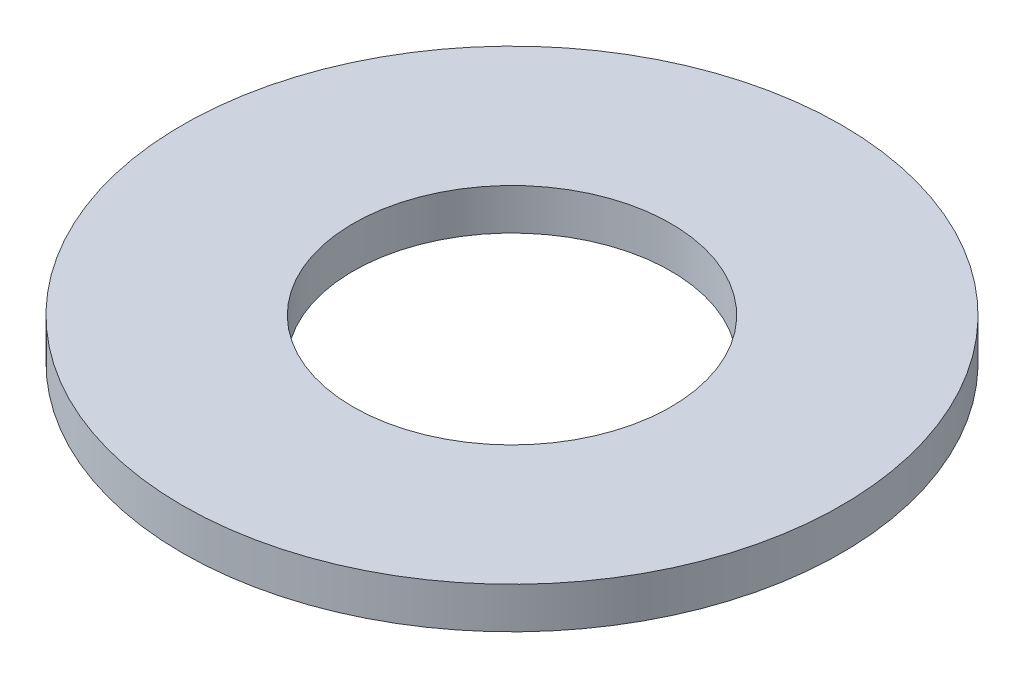
ISO-10303-21;
HEADER;
FILE_DESCRIPTION(('STEP AP214'),'2;1');
FILE_NAME('part.step','',(''),(''),'','','');
FILE_SCHEMA(('AUTOMOTIVE_DESIGN { 1 0 10303 214 1 1 1 1 }'));
ENDSEC;
DATA;
#1=APPLICATION_CONTEXT('core data for automotive mechanical design processes');
#2=APPLICATION_PROTOCOL_DEFINITION('international standard','automotive_design',2000,#1);
#3=PRODUCT_CONTEXT('',#1,'mechanical');
#4=PRODUCT('Part','Part','',(#3));
#5=PRODUCT_RELATED_PRODUCT_CATEGORY('part','',(#4));
#6=PRODUCT_DEFINITION_FORMATION('','',#4);
#7=PRODUCT_DEFINITION_CONTEXT('part definition',#1,'design');
#8=PRODUCT_DEFINITION('design','',#6,#7);
#9=PRODUCT_DEFINITION_SHAPE('','',#8);
#10=(LENGTH_UNIT() NAMED_UNIT(*) SI_UNIT(.MILLI.,.METRE.));
#11=(NAMED_UNIT(*) PLANE_ANGLE_UNIT() SI_UNIT($,.RADIAN.));
#12=(NAMED_UNIT(*) SI_UNIT($,.STERADIAN.) SOLID_ANGLE_UNIT());
#13=UNCERTAINTY_MEASURE_WITH_UNIT(LENGTH_MEASURE(1.E-05),#10,'distance_accuracy_value','');
#14=(GEOMETRIC_REPRESENTATION_CONTEXT(3) GLOBAL_UNCERTAINTY_ASSIGNED_CONTEXT((#13)) GLOBAL_UNIT_ASSIGNED_CONTEXT((#10,
#11,#12)) REPRESENTATION_CONTEXT('',''));
#15=CARTESIAN_POINT('',(0.,0.,0.));
#16=DIRECTION('',(0.,0.,1.));
#17=DIRECTION('',(1.,0.,0.));
#18=AXIS2_PLACEMENT_3D('',#15,#16,#17);
#19=CARTESIAN_POINT('',(0.,0.7,0.));
#20=DIRECTION('',(0.,1.,0.));
#21=DIRECTION('',(0.,0.,1.));
#22=AXIS2_PLACEMENT_3D('',#19,#20,#21);
#23=PLANE('',#22);
#24=CARTESIAN_POINT('',(0.,0.7,0.));
#25=DIRECTION('',(0.,1.,0.));
#26=DIRECTION('',(0.,0.,1.));
#27=AXIS2_PLACEMENT_3D('',#24,#25,#26);
#28=CIRCLE('',#27,5.6);
#29=CARTESIAN_POINT('',(0.,0.7,5.6));
#30=VERTEX_POINT('',#29);
#31=EDGE_CURVE('E10',#30,#30,#28,.T.);
#32=ORIENTED_EDGE('',*,*,#31,.T.);
#33=EDGE_LOOP('',(#32));
#34=FACE_BOUND('',#33,.T.);
#35=CARTESIAN_POINT('',(0.,0.7,0.));
#36=DIRECTION('',(0.,1.,0.));
#37=DIRECTION('',(0.,0.,1.));
#38=AXIS2_PLACEMENT_3D('',#35,#36,#37);
#39=CIRCLE('',#38,2.7);
#40=CARTESIAN_POINT('',(0.,0.7,2.7));
#41=VERTEX_POINT('',#40);
#42=EDGE_CURVE('E52',#41,#41,#39,.T.);
#43=ORIENTED_EDGE('',*,*,#42,.F.);
#44=EDGE_LOOP('',(#43));
#45=FACE_BOUND('',#44,.T.);
#46=ADVANCED_FACE('F39',(#34,#45),#23,.T.);
#47=CARTESIAN_POINT('',(0.,0.,0.));
#48=DIRECTION('',(0.,1.,0.));
#49=DIRECTION('',(0.,0.,1.));
#50=AXIS2_PLACEMENT_3D('',#47,#48,#49);
#51=PLANE('',#50);
#52=CARTESIAN_POINT('',(0.,0.,0.));
#53=DIRECTION('',(0.,1.,0.));
#54=DIRECTION('',(0.,0.,1.));
#55=AXIS2_PLACEMENT_3D('',#52,#53,#54);
#56=CIRCLE('',#55,5.6);
#57=CARTESIAN_POINT('',(0.,0.,5.6));
#58=VERTEX_POINT('',#57);
#59=EDGE_CURVE('E43',#58,#58,#56,.T.);
#60=ORIENTED_EDGE('',*,*,#59,.F.);
#61=EDGE_LOOP('',(#60));
#62=FACE_BOUND('',#61,.T.);
#63=CARTESIAN_POINT('',(0.,0.,0.));
#64=DIRECTION('',(0.,1.,0.));
#65=DIRECTION('',(0.,0.,1.));
#66=AXIS2_PLACEMENT_3D('',#63,#64,#65);
#67=CIRCLE('',#66,2.7);
#68=CARTESIAN_POINT('',(0.,0.,2.7));
#69=VERTEX_POINT('',#68);
#70=EDGE_CURVE('E54',#69,#69,#67,.T.);
#71=ORIENTED_EDGE('',*,*,#70,.T.);
#72=EDGE_LOOP('',(#71));
#73=FACE_BOUND('',#72,.T.);
#74=ADVANCED_FACE('F66',(#62,#73),#51,.F.);
#75=CARTESIAN_POINT('',(0.,0.7,0.));
#76=DIRECTION('',(0.,-1.,0.));
#77=DIRECTION('',(0.,0.,-1.));
#78=AXIS2_PLACEMENT_3D('',#75,#76,#77);
#79=CYLINDRICAL_SURFACE('',#78,5.6);
#80=ORIENTED_EDGE('',*,*,#31,.F.);
#81=EDGE_LOOP('',(#80));
#82=FACE_BOUND('',#81,.T.);
#83=ORIENTED_EDGE('',*,*,#59,.T.);
#84=EDGE_LOOP('',(#83));
#85=FACE_BOUND('',#84,.T.);
#86=ADVANCED_FACE('F41',(#82,#85),#79,.T.);
#87=CARTESIAN_POINT('',(0.,0.7,0.));
#88=DIRECTION('',(0.,-1.,0.));
#89=DIRECTION('',(0.,0.,-1.));
#90=AXIS2_PLACEMENT_3D('',#87,#88,#89);
#91=CYLINDRICAL_SURFACE('',#90,2.7);
#92=ORIENTED_EDGE('',*,*,#42,.T.);
#93=EDGE_LOOP('',(#92));
#94=FACE_BOUND('',#93,.T.);
#95=ORIENTED_EDGE('',*,*,#70,.F.);
#96=EDGE_LOOP('',(#95));
#97=FACE_BOUND('',#96,.T.);
#98=ADVANCED_FACE('F62',(#94,#97),#91,.F.);
#99=CLOSED_SHELL('',(#46,#74,#86,#98));
#100=MANIFOLD_SOLID_BREP('B2',#99);
#101=ADVANCED_BREP_SHAPE_REPRESENTATION('',(#18,#100),#14);
#102=SHAPE_DEFINITION_REPRESENTATION(#9,#101);
ENDSEC;
END-ISO-10303-21;
